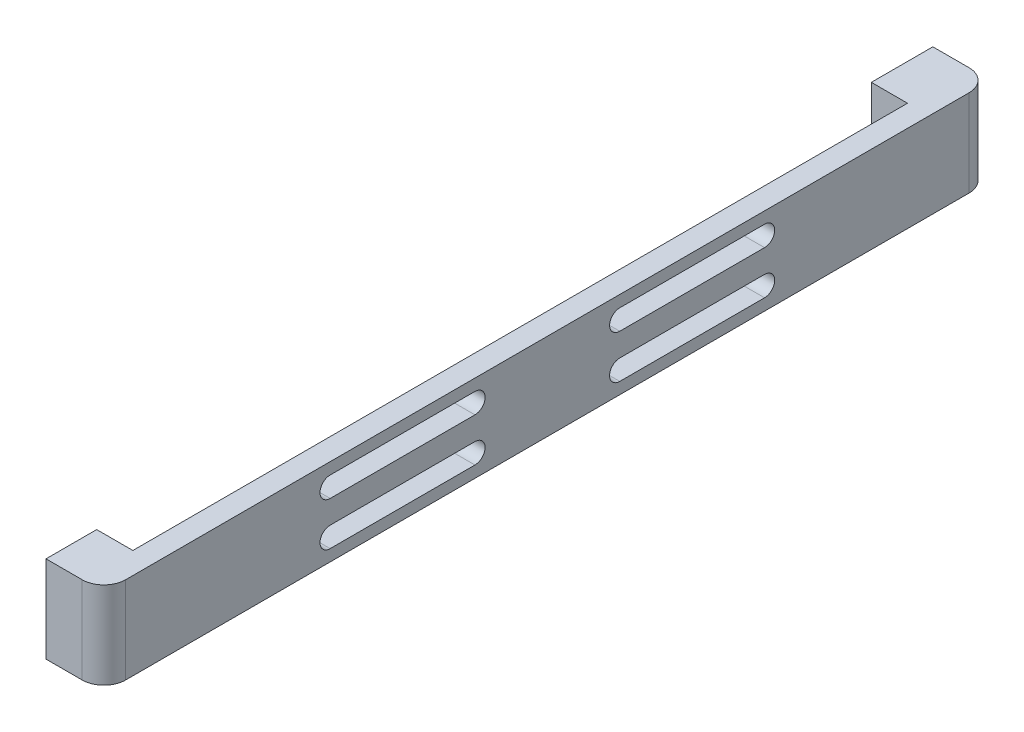
ISO-10303-21;
HEADER;
FILE_DESCRIPTION(('STEP AP214'),'2;1');
FILE_NAME('part.step','',(''),(''),'','','');
FILE_SCHEMA(('AUTOMOTIVE_DESIGN { 1 0 10303 214 1 1 1 1 }'));
ENDSEC;
DATA;
#1=APPLICATION_CONTEXT('core data for automotive mechanical design processes');
#2=APPLICATION_PROTOCOL_DEFINITION('international standard','automotive_design',2000,#1);
#3=PRODUCT_CONTEXT('',#1,'mechanical');
#4=PRODUCT('Part','Part','',(#3));
#5=PRODUCT_RELATED_PRODUCT_CATEGORY('part','',(#4));
#6=PRODUCT_DEFINITION_FORMATION('','',#4);
#7=PRODUCT_DEFINITION_CONTEXT('part definition',#1,'design');
#8=PRODUCT_DEFINITION('design','',#6,#7);
#9=PRODUCT_DEFINITION_SHAPE('','',#8);
#10=(LENGTH_UNIT() NAMED_UNIT(*) SI_UNIT(.MILLI.,.METRE.));
#11=(NAMED_UNIT(*) PLANE_ANGLE_UNIT() SI_UNIT($,.RADIAN.));
#12=(NAMED_UNIT(*) SI_UNIT($,.STERADIAN.) SOLID_ANGLE_UNIT());
#13=UNCERTAINTY_MEASURE_WITH_UNIT(LENGTH_MEASURE(1.E-05),#10,'distance_accuracy_value','');
#14=(GEOMETRIC_REPRESENTATION_CONTEXT(3) GLOBAL_UNCERTAINTY_ASSIGNED_CONTEXT((#13)) GLOBAL_UNIT_ASSIGNED_CONTEXT((#10,
#11,#12)) REPRESENTATION_CONTEXT('',''));
#15=CARTESIAN_POINT('',(0.,0.,0.));
#16=DIRECTION('',(0.,0.,1.));
#17=DIRECTION('',(1.,0.,0.));
#18=AXIS2_PLACEMENT_3D('',#15,#16,#17);
#19=CARTESIAN_POINT('',(5.,0.,0.));
#20=DIRECTION('',(1.,0.,0.));
#21=DIRECTION('',(0.,0.,-1.));
#22=AXIS2_PLACEMENT_3D('',#19,#20,#21);
#23=PLANE('',#22);
#24=CARTESIAN_POINT('',(5.,-3.,29.25));
#25=DIRECTION('',(1.,0.,0.));
#26=DIRECTION('',(0.,0.,-1.));
#27=AXIS2_PLACEMENT_3D('',#24,#25,#26);
#28=CIRCLE('',#27,1.4);
#29=CARTESIAN_POINT('',(5.,-1.6,29.25));
#30=VERTEX_POINT('',#29);
#31=CARTESIAN_POINT('',(5.,-4.4,29.25));
#32=VERTEX_POINT('',#31);
#33=EDGE_CURVE('E261',#30,#32,#28,.T.);
#34=ORIENTED_EDGE('',*,*,#33,.T.);
#35=DIRECTION('',(0.,0.,-1.));
#36=VECTOR('',#35,1.);
#37=CARTESIAN_POINT('',(5.,-4.4,0.));
#38=LINE('',#37,#36);
#39=CARTESIAN_POINT('',(5.,-4.4,9.25000000000001));
#40=VERTEX_POINT('',#39);
#41=EDGE_CURVE('E251',#32,#40,#38,.T.);
#42=ORIENTED_EDGE('',*,*,#41,.T.);
#43=CARTESIAN_POINT('',(5.,-3.,9.25000000000001));
#44=DIRECTION('',(1.,0.,0.));
#45=DIRECTION('',(0.,0.,-1.));
#46=AXIS2_PLACEMENT_3D('',#43,#44,#45);
#47=CIRCLE('',#46,1.4);
#48=CARTESIAN_POINT('',(5.,-1.6,9.25000000000001));
#49=VERTEX_POINT('',#48);
#50=EDGE_CURVE('E254',#40,#49,#47,.T.);
#51=ORIENTED_EDGE('',*,*,#50,.T.);
#52=DIRECTION('',(0.,0.,-1.));
#53=VECTOR('',#52,1.);
#54=CARTESIAN_POINT('',(5.,-1.59999999999999,0.));
#55=LINE('',#54,#53);
#56=EDGE_CURVE('E258',#30,#49,#55,.T.);
#57=ORIENTED_EDGE('',*,*,#56,.F.);
#58=EDGE_LOOP('',(#34,#42,#51,#57));
#59=FACE_BOUND('',#58,.T.);
#60=CARTESIAN_POINT('',(5.,3.00000000000001,-30.75));
#61=DIRECTION('',(1.,0.,0.));
#62=DIRECTION('',(0.,0.,-1.));
#63=AXIS2_PLACEMENT_3D('',#60,#61,#62);
#64=CIRCLE('',#63,1.4);
#65=CARTESIAN_POINT('',(5.,1.6,-30.75));
#66=VERTEX_POINT('',#65);
#67=CARTESIAN_POINT('',(5.,4.40000000000001,-30.75));
#68=VERTEX_POINT('',#67);
#69=EDGE_CURVE('E295',#66,#68,#64,.T.);
#70=ORIENTED_EDGE('',*,*,#69,.T.);
#71=DIRECTION('',(0.,0.,1.));
#72=VECTOR('',#71,1.);
#73=CARTESIAN_POINT('',(5.,4.4,0.));
#74=LINE('',#73,#72);
#75=CARTESIAN_POINT('',(5.,4.4,-10.75));
#76=VERTEX_POINT('',#75);
#77=EDGE_CURVE('E285',#68,#76,#74,.T.);
#78=ORIENTED_EDGE('',*,*,#77,.T.);
#79=CARTESIAN_POINT('',(5.,3.,-10.75));
#80=DIRECTION('',(1.,0.,0.));
#81=DIRECTION('',(0.,0.,-1.));
#82=AXIS2_PLACEMENT_3D('',#79,#80,#81);
#83=CIRCLE('',#82,1.4);
#84=CARTESIAN_POINT('',(5.,1.6,-10.75));
#85=VERTEX_POINT('',#84);
#86=EDGE_CURVE('E288',#76,#85,#83,.T.);
#87=ORIENTED_EDGE('',*,*,#86,.T.);
#88=DIRECTION('',(0.,0.,1.));
#89=VECTOR('',#88,1.);
#90=CARTESIAN_POINT('',(5.,1.59999999999999,0.));
#91=LINE('',#90,#89);
#92=EDGE_CURVE('E292',#66,#85,#91,.T.);
#93=ORIENTED_EDGE('',*,*,#92,.F.);
#94=EDGE_LOOP('',(#70,#78,#87,#93));
#95=FACE_BOUND('',#94,.T.);
#96=CARTESIAN_POINT('',(5.,-2.99999999999999,-30.75));
#97=DIRECTION('',(1.,0.,0.));
#98=DIRECTION('',(0.,0.,-1.));
#99=AXIS2_PLACEMENT_3D('',#96,#97,#98);
#100=CIRCLE('',#99,1.4);
#101=CARTESIAN_POINT('',(5.,-4.4,-30.75));
#102=VERTEX_POINT('',#101);
#103=CARTESIAN_POINT('',(5.,-1.6,-30.75));
#104=VERTEX_POINT('',#103);
#105=EDGE_CURVE('E220',#102,#104,#100,.T.);
#106=ORIENTED_EDGE('',*,*,#105,.T.);
#107=DIRECTION('',(0.,0.,1.));
#108=VECTOR('',#107,1.);
#109=CARTESIAN_POINT('',(5.,-1.6,0.));
#110=LINE('',#109,#108);
#111=CARTESIAN_POINT('',(5.,-1.6,-10.75));
#112=VERTEX_POINT('',#111);
#113=EDGE_CURVE('E212',#104,#112,#110,.T.);
#114=ORIENTED_EDGE('',*,*,#113,.T.);
#115=CARTESIAN_POINT('',(5.,-3.,-10.75));
#116=DIRECTION('',(1.,0.,0.));
#117=DIRECTION('',(0.,0.,-1.));
#118=AXIS2_PLACEMENT_3D('',#115,#116,#117);
#119=CIRCLE('',#118,1.4);
#120=CARTESIAN_POINT('',(5.,-4.4,-10.75));
#121=VERTEX_POINT('',#120);
#122=EDGE_CURVE('E223',#112,#121,#119,.T.);
#123=ORIENTED_EDGE('',*,*,#122,.T.);
#124=DIRECTION('',(0.,0.,1.));
#125=VECTOR('',#124,1.);
#126=CARTESIAN_POINT('',(5.,-4.40000000000001,0.));
#127=LINE('',#126,#125);
#128=EDGE_CURVE('E228',#102,#121,#127,.T.);
#129=ORIENTED_EDGE('',*,*,#128,.F.);
#130=EDGE_LOOP('',(#106,#114,#123,#129));
#131=FACE_BOUND('',#130,.T.);
#132=DIRECTION('',(0.,0.,1.));
#133=VECTOR('',#132,1.);
#134=CARTESIAN_POINT('',(5.,5.99999999999999,60.5));
#135=LINE('',#134,#133);
#136=CARTESIAN_POINT('',(5.,6.00000000000001,-53.5));
#137=VERTEX_POINT('',#136);
#138=CARTESIAN_POINT('',(5.,5.99999999999999,53.5));
#139=VERTEX_POINT('',#138);
#140=EDGE_CURVE('E370',#137,#139,#135,.T.);
#141=ORIENTED_EDGE('',*,*,#140,.F.);
#142=DIRECTION('',(0.,1.,0.));
#143=VECTOR('',#142,1.);
#144=CARTESIAN_POINT('',(5.,0.,-53.5));
#145=LINE('',#144,#143);
#146=CARTESIAN_POINT('',(5.,-5.99999999999999,-53.5));
#147=VERTEX_POINT('',#146);
#148=EDGE_CURVE('E347',#147,#137,#145,.T.);
#149=ORIENTED_EDGE('',*,*,#148,.F.);
#150=DIRECTION('',(0.,0.,-1.));
#151=VECTOR('',#150,1.);
#152=CARTESIAN_POINT('',(5.,-5.99999999999999,60.5));
#153=LINE('',#152,#151);
#154=CARTESIAN_POINT('',(5.,-6.00000000000001,53.5));
#155=VERTEX_POINT('',#154);
#156=EDGE_CURVE('E365',#155,#147,#153,.T.);
#157=ORIENTED_EDGE('',*,*,#156,.F.);
#158=DIRECTION('',(0.,1.,0.));
#159=VECTOR('',#158,1.);
#160=CARTESIAN_POINT('',(5.,0.,53.5));
#161=LINE('',#160,#159);
#162=EDGE_CURVE('E381',#155,#139,#161,.T.);
#163=ORIENTED_EDGE('',*,*,#162,.T.);
#164=EDGE_LOOP('',(#141,#149,#157,#163));
#165=FACE_BOUND('',#164,.T.);
#166=DIRECTION('',(0.,0.,-1.));
#167=VECTOR('',#166,1.);
#168=CARTESIAN_POINT('',(5.,4.40000000000001,0.));
#169=LINE('',#168,#167);
#170=CARTESIAN_POINT('',(5.,4.4,29.25));
#171=VERTEX_POINT('',#170);
#172=CARTESIAN_POINT('',(5.,4.4,9.25000000000001));
#173=VERTEX_POINT('',#172);
#174=EDGE_CURVE('E315',#171,#173,#169,.T.);
#175=ORIENTED_EDGE('',*,*,#174,.F.);
#176=CARTESIAN_POINT('',(5.,3.,29.25));
#177=DIRECTION('',(1.,0.,0.));
#178=DIRECTION('',(0.,0.,-1.));
#179=AXIS2_PLACEMENT_3D('',#176,#177,#178);
#180=CIRCLE('',#179,1.4);
#181=CARTESIAN_POINT('',(5.,1.6,29.25));
#182=VERTEX_POINT('',#181);
#183=EDGE_CURVE('E317',#171,#182,#180,.T.);
#184=ORIENTED_EDGE('',*,*,#183,.T.);
#185=DIRECTION('',(0.,0.,-1.));
#186=VECTOR('',#185,1.);
#187=CARTESIAN_POINT('',(5.,1.60000000000001,0.));
#188=LINE('',#187,#186);
#189=CARTESIAN_POINT('',(5.,1.6,9.25000000000001));
#190=VERTEX_POINT('',#189);
#191=EDGE_CURVE('E321',#182,#190,#188,.T.);
#192=ORIENTED_EDGE('',*,*,#191,.T.);
#193=CARTESIAN_POINT('',(5.,3.,9.25000000000001));
#194=DIRECTION('',(1.,0.,0.));
#195=DIRECTION('',(0.,0.,-1.));
#196=AXIS2_PLACEMENT_3D('',#193,#194,#195);
#197=CIRCLE('',#196,1.4);
#198=EDGE_CURVE('E324',#190,#173,#197,.T.);
#199=ORIENTED_EDGE('',*,*,#198,.T.);
#200=EDGE_LOOP('',(#175,#184,#192,#199));
#201=FACE_BOUND('',#200,.T.);
#202=ADVANCED_FACE('F35',(#59,#95,#131,#165,#201),#23,.F.);
#203=CARTESIAN_POINT('',(8.,0.,0.));
#204=DIRECTION('',(1.,0.,0.));
#205=DIRECTION('',(0.,0.,-1.));
#206=AXIS2_PLACEMENT_3D('',#203,#204,#205);
#207=PLANE('',#206);
#208=DIRECTION('',(0.,0.,-1.));
#209=VECTOR('',#208,1.);
#210=CARTESIAN_POINT('',(8.,-4.4,0.));
#211=LINE('',#210,#209);
#212=CARTESIAN_POINT('',(8.,-4.4,29.25));
#213=VERTEX_POINT('',#212);
#214=CARTESIAN_POINT('',(8.,-4.4,9.25000000000001));
#215=VERTEX_POINT('',#214);
#216=EDGE_CURVE('E265',#213,#215,#211,.T.);
#217=ORIENTED_EDGE('',*,*,#216,.F.);
#218=CARTESIAN_POINT('',(8.,-3.,29.25));
#219=DIRECTION('',(1.,0.,0.));
#220=DIRECTION('',(0.,0.,-1.));
#221=AXIS2_PLACEMENT_3D('',#218,#219,#220);
#222=CIRCLE('',#221,1.4);
#223=CARTESIAN_POINT('',(8.,-1.6,29.25));
#224=VERTEX_POINT('',#223);
#225=EDGE_CURVE('E255',#224,#213,#222,.T.);
#226=ORIENTED_EDGE('',*,*,#225,.F.);
#227=DIRECTION('',(0.,0.,-1.));
#228=VECTOR('',#227,1.);
#229=CARTESIAN_POINT('',(8.,-1.59999999999999,0.));
#230=LINE('',#229,#228);
#231=CARTESIAN_POINT('',(8.,-1.6,9.25000000000001));
#232=VERTEX_POINT('',#231);
#233=EDGE_CURVE('E271',#224,#232,#230,.T.);
#234=ORIENTED_EDGE('',*,*,#233,.T.);
#235=CARTESIAN_POINT('',(8.,-3.,9.25000000000001));
#236=DIRECTION('',(1.,0.,0.));
#237=DIRECTION('',(0.,0.,-1.));
#238=AXIS2_PLACEMENT_3D('',#235,#236,#237);
#239=CIRCLE('',#238,1.4);
#240=EDGE_CURVE('E267',#215,#232,#239,.T.);
#241=ORIENTED_EDGE('',*,*,#240,.F.);
#242=EDGE_LOOP('',(#217,#226,#234,#241));
#243=FACE_BOUND('',#242,.T.);
#244=DIRECTION('',(0.,0.,1.));
#245=VECTOR('',#244,1.);
#246=CARTESIAN_POINT('',(8.,4.4,0.));
#247=LINE('',#246,#245);
#248=CARTESIAN_POINT('',(8.,4.40000000000001,-30.75));
#249=VERTEX_POINT('',#248);
#250=CARTESIAN_POINT('',(8.,4.4,-10.75));
#251=VERTEX_POINT('',#250);
#252=EDGE_CURVE('E247',#249,#251,#247,.T.);
#253=ORIENTED_EDGE('',*,*,#252,.F.);
#254=CARTESIAN_POINT('',(8.,3.00000000000001,-30.75));
#255=DIRECTION('',(1.,0.,0.));
#256=DIRECTION('',(0.,0.,-1.));
#257=AXIS2_PLACEMENT_3D('',#254,#255,#256);
#258=CIRCLE('',#257,1.4);
#259=CARTESIAN_POINT('',(8.,1.6,-30.75));
#260=VERTEX_POINT('',#259);
#261=EDGE_CURVE('E289',#260,#249,#258,.T.);
#262=ORIENTED_EDGE('',*,*,#261,.F.);
#263=DIRECTION('',(0.,0.,1.));
#264=VECTOR('',#263,1.);
#265=CARTESIAN_POINT('',(8.,1.59999999999999,0.));
#266=LINE('',#265,#264);
#267=CARTESIAN_POINT('',(8.,1.6,-10.75));
#268=VERTEX_POINT('',#267);
#269=EDGE_CURVE('E303',#260,#268,#266,.T.);
#270=ORIENTED_EDGE('',*,*,#269,.T.);
#271=CARTESIAN_POINT('',(8.,3.,-10.75));
#272=DIRECTION('',(1.,0.,0.));
#273=DIRECTION('',(0.,0.,-1.));
#274=AXIS2_PLACEMENT_3D('',#271,#272,#273);
#275=CIRCLE('',#274,1.4);
#276=EDGE_CURVE('E300',#251,#268,#275,.T.);
#277=ORIENTED_EDGE('',*,*,#276,.F.);
#278=EDGE_LOOP('',(#253,#262,#270,#277));
#279=FACE_BOUND('',#278,.T.);
#280=DIRECTION('',(0.,0.,1.));
#281=VECTOR('',#280,1.);
#282=CARTESIAN_POINT('',(8.,-1.6,0.));
#283=LINE('',#282,#281);
#284=CARTESIAN_POINT('',(8.,-1.6,-30.75));
#285=VERTEX_POINT('',#284);
#286=CARTESIAN_POINT('',(8.,-1.6,-10.75));
#287=VERTEX_POINT('',#286);
#288=EDGE_CURVE('E215',#285,#287,#283,.T.);
#289=ORIENTED_EDGE('',*,*,#288,.F.);
#290=CARTESIAN_POINT('',(8.,-2.99999999999999,-30.75));
#291=DIRECTION('',(1.,0.,0.));
#292=DIRECTION('',(0.,0.,-1.));
#293=AXIS2_PLACEMENT_3D('',#290,#291,#292);
#294=CIRCLE('',#293,1.4);
#295=CARTESIAN_POINT('',(8.,-4.4,-30.75));
#296=VERTEX_POINT('',#295);
#297=EDGE_CURVE('E232',#296,#285,#294,.T.);
#298=ORIENTED_EDGE('',*,*,#297,.F.);
#299=DIRECTION('',(0.,0.,1.));
#300=VECTOR('',#299,1.);
#301=CARTESIAN_POINT('',(8.,-4.40000000000001,0.));
#302=LINE('',#301,#300);
#303=CARTESIAN_POINT('',(8.,-4.4,-10.75));
#304=VERTEX_POINT('',#303);
#305=EDGE_CURVE('E235',#296,#304,#302,.T.);
#306=ORIENTED_EDGE('',*,*,#305,.T.);
#307=CARTESIAN_POINT('',(8.,-3.,-10.75));
#308=DIRECTION('',(1.,0.,0.));
#309=DIRECTION('',(0.,0.,-1.));
#310=AXIS2_PLACEMENT_3D('',#307,#308,#309);
#311=CIRCLE('',#310,1.4);
#312=EDGE_CURVE('E241',#287,#304,#311,.T.);
#313=ORIENTED_EDGE('',*,*,#312,.F.);
#314=EDGE_LOOP('',(#289,#298,#306,#313));
#315=FACE_BOUND('',#314,.T.);
#316=DIRECTION('',(0.,0.,-1.));
#317=VECTOR('',#316,1.);
#318=CARTESIAN_POINT('',(8.,-5.99999999999999,60.5));
#319=LINE('',#318,#317);
#320=CARTESIAN_POINT('',(8.,-5.99999999999999,57.5));
#321=VERTEX_POINT('',#320);
#322=CARTESIAN_POINT('',(8.,-5.99999999999999,-59.));
#323=VERTEX_POINT('',#322);
#324=EDGE_CURVE('E366',#321,#323,#319,.T.);
#325=ORIENTED_EDGE('',*,*,#324,.T.);
#326=DIRECTION('',(0.,1.,0.));
#327=VECTOR('',#326,1.);
#328=CARTESIAN_POINT('',(8.,5.99999999999999,-59.));
#329=LINE('',#328,#327);
#330=CARTESIAN_POINT('',(8.,5.99999999999999,-59.));
#331=VERTEX_POINT('',#330);
#332=EDGE_CURVE('E406',#323,#331,#329,.T.);
#333=ORIENTED_EDGE('',*,*,#332,.T.);
#334=DIRECTION('',(0.,0.,1.));
#335=VECTOR('',#334,1.);
#336=CARTESIAN_POINT('',(8.,5.99999999999999,60.5));
#337=LINE('',#336,#335);
#338=CARTESIAN_POINT('',(8.,5.99999999999999,57.5));
#339=VERTEX_POINT('',#338);
#340=EDGE_CURVE('E369',#331,#339,#337,.T.);
#341=ORIENTED_EDGE('',*,*,#340,.T.);
#342=DIRECTION('',(0.,-1.,0.));
#343=VECTOR('',#342,1.);
#344=CARTESIAN_POINT('',(8.,-5.99999999999999,57.5));
#345=LINE('',#344,#343);
#346=EDGE_CURVE('E403',#339,#321,#345,.T.);
#347=ORIENTED_EDGE('',*,*,#346,.T.);
#348=EDGE_LOOP('',(#325,#333,#341,#347));
#349=FACE_BOUND('',#348,.T.);
#350=CARTESIAN_POINT('',(8.,3.,29.25));
#351=DIRECTION('',(1.,0.,0.));
#352=DIRECTION('',(0.,0.,-1.));
#353=AXIS2_PLACEMENT_3D('',#350,#351,#352);
#354=CIRCLE('',#353,1.4);
#355=CARTESIAN_POINT('',(8.,4.4,29.25));
#356=VERTEX_POINT('',#355);
#357=CARTESIAN_POINT('',(8.,1.6,29.25));
#358=VERTEX_POINT('',#357);
#359=EDGE_CURVE('E330',#356,#358,#354,.T.);
#360=ORIENTED_EDGE('',*,*,#359,.F.);
#361=DIRECTION('',(0.,0.,-1.));
#362=VECTOR('',#361,1.);
#363=CARTESIAN_POINT('',(8.,4.40000000000001,0.));
#364=LINE('',#363,#362);
#365=CARTESIAN_POINT('',(8.,4.4,9.25000000000001));
#366=VERTEX_POINT('',#365);
#367=EDGE_CURVE('E278',#356,#366,#364,.T.);
#368=ORIENTED_EDGE('',*,*,#367,.T.);
#369=CARTESIAN_POINT('',(8.,3.,9.25000000000001));
#370=DIRECTION('',(1.,0.,0.));
#371=DIRECTION('',(0.,0.,-1.));
#372=AXIS2_PLACEMENT_3D('',#369,#370,#371);
#373=CIRCLE('',#372,1.4);
#374=CARTESIAN_POINT('',(8.,1.6,9.25000000000001));
#375=VERTEX_POINT('',#374);
#376=EDGE_CURVE('E318',#375,#366,#373,.T.);
#377=ORIENTED_EDGE('',*,*,#376,.F.);
#378=DIRECTION('',(0.,0.,-1.));
#379=VECTOR('',#378,1.);
#380=CARTESIAN_POINT('',(8.,1.60000000000001,0.));
#381=LINE('',#380,#379);
#382=EDGE_CURVE('E333',#358,#375,#381,.T.);
#383=ORIENTED_EDGE('',*,*,#382,.F.);
#384=EDGE_LOOP('',(#360,#368,#377,#383));
#385=FACE_BOUND('',#384,.T.);
#386=ADVANCED_FACE('F419',(#243,#279,#315,#349,#385),#207,.T.);
#387=CARTESIAN_POINT('',(5.,5.99999999999998,0.));
#388=DIRECTION('',(0.,-1.,0.));
#389=DIRECTION('',(0.,0.,-1.));
#390=AXIS2_PLACEMENT_3D('',#387,#388,#389);
#391=PLANE('',#390);
#392=ORIENTED_EDGE('',*,*,#340,.F.);
#393=CARTESIAN_POINT('',(5.,5.99999999999996,-59.));
#394=DIRECTION('',(0.,-1.,0.));
#395=DIRECTION('',(0.,0.,-1.));
#396=AXIS2_PLACEMENT_3D('',#393,#394,#395);
#397=CIRCLE('',#396,3.);
#398=CARTESIAN_POINT('',(5.,5.99999999999999,-62.));
#399=VERTEX_POINT('',#398);
#400=EDGE_CURVE('E411',#331,#399,#397,.F.);
#401=ORIENTED_EDGE('',*,*,#400,.T.);
#402=DIRECTION('',(-1.,0.,0.));
#403=VECTOR('',#402,1.);
#404=CARTESIAN_POINT('',(8.,5.99999999999999,-62.));
#405=LINE('',#404,#403);
#406=CARTESIAN_POINT('',(0.,6.00000000000001,-62.));
#407=VERTEX_POINT('',#406);
#408=EDGE_CURVE('E373',#399,#407,#405,.T.);
#409=ORIENTED_EDGE('',*,*,#408,.T.);
#410=DIRECTION('',(0.,0.,-1.));
#411=VECTOR('',#410,1.);
#412=CARTESIAN_POINT('',(0.,6.,0.));
#413=LINE('',#412,#411);
#414=CARTESIAN_POINT('',(0.,6.00000000000001,-53.5));
#415=VERTEX_POINT('',#414);
#416=EDGE_CURVE('E354',#415,#407,#413,.T.);
#417=ORIENTED_EDGE('',*,*,#416,.F.);
#418=DIRECTION('',(-1.,0.,0.));
#419=VECTOR('',#418,1.);
#420=CARTESIAN_POINT('',(5.,6.00000000000001,-53.5));
#421=LINE('',#420,#419);
#422=EDGE_CURVE('E363',#137,#415,#421,.T.);
#423=ORIENTED_EDGE('',*,*,#422,.F.);
#424=ORIENTED_EDGE('',*,*,#140,.T.);
#425=DIRECTION('',(-1.,0.,0.));
#426=VECTOR('',#425,1.);
#427=CARTESIAN_POINT('',(5.,5.99999999999999,53.5));
#428=LINE('',#427,#426);
#429=CARTESIAN_POINT('',(0.,5.99999999999999,53.5));
#430=VERTEX_POINT('',#429);
#431=EDGE_CURVE('E384',#139,#430,#428,.T.);
#432=ORIENTED_EDGE('',*,*,#431,.T.);
#433=DIRECTION('',(0.,0.,1.));
#434=VECTOR('',#433,1.);
#435=CARTESIAN_POINT('',(0.,5.99999999999998,0.));
#436=LINE('',#435,#434);
#437=CARTESIAN_POINT('',(0.,5.99999999999999,60.5));
#438=VERTEX_POINT('',#437);
#439=EDGE_CURVE('E380',#430,#438,#436,.T.);
#440=ORIENTED_EDGE('',*,*,#439,.T.);
#441=DIRECTION('',(-1.,0.,0.));
#442=VECTOR('',#441,1.);
#443=CARTESIAN_POINT('',(5.,5.99999999999999,60.5));
#444=LINE('',#443,#442);
#445=CARTESIAN_POINT('',(5.,5.99999999999999,60.5));
#446=VERTEX_POINT('',#445);
#447=EDGE_CURVE('E401',#446,#438,#444,.T.);
#448=ORIENTED_EDGE('',*,*,#447,.F.);
#449=CARTESIAN_POINT('',(5.,5.99999999999999,57.5));
#450=DIRECTION('',(0.,-1.,0.));
#451=DIRECTION('',(0.,0.,-1.));
#452=AXIS2_PLACEMENT_3D('',#449,#450,#451);
#453=CIRCLE('',#452,3.);
#454=EDGE_CURVE('E409',#446,#339,#453,.F.);
#455=ORIENTED_EDGE('',*,*,#454,.T.);
#456=EDGE_LOOP('',(#392,#401,#409,#417,#423,#424,#432,#440,#448,#455));
#457=FACE_BOUND('',#456,.T.);
#458=ADVANCED_FACE('F425',(#457),#391,.F.);
#459=CARTESIAN_POINT('',(5.,0.,60.5));
#460=DIRECTION('',(0.,0.,-1.));
#461=DIRECTION('',(-1.,0.,0.));
#462=AXIS2_PLACEMENT_3D('',#459,#460,#461);
#463=PLANE('',#462);
#464=DIRECTION('',(-1.,0.,0.));
#465=VECTOR('',#464,1.);
#466=CARTESIAN_POINT('',(5.,-6.00000000000001,60.5));
#467=LINE('',#466,#465);
#468=CARTESIAN_POINT('',(5.,-6.00000000000001,60.5));
#469=VERTEX_POINT('',#468);
#470=CARTESIAN_POINT('',(0.,-6.00000000000001,60.5));
#471=VERTEX_POINT('',#470);
#472=EDGE_CURVE('E399',#469,#471,#467,.T.);
#473=ORIENTED_EDGE('',*,*,#472,.F.);
#474=DIRECTION('',(0.,-1.,0.));
#475=VECTOR('',#474,1.);
#476=CARTESIAN_POINT('',(5.,5.99999999999999,60.5));
#477=LINE('',#476,#475);
#478=EDGE_CURVE('E11',#469,#446,#477,.F.);
#479=ORIENTED_EDGE('',*,*,#478,.T.);
#480=ORIENTED_EDGE('',*,*,#447,.T.);
#481=DIRECTION('',(0.,-1.,0.));
#482=VECTOR('',#481,1.);
#483=CARTESIAN_POINT('',(0.,0.,60.5));
#484=LINE('',#483,#482);
#485=EDGE_CURVE('E388',#438,#471,#484,.T.);
#486=ORIENTED_EDGE('',*,*,#485,.T.);
#487=EDGE_LOOP('',(#473,#479,#480,#486));
#488=FACE_BOUND('',#487,.T.);
#489=ADVANCED_FACE('F451',(#488),#463,.F.);
#490=CARTESIAN_POINT('',(5.,-6.,0.));
#491=DIRECTION('',(0.,-1.,0.));
#492=DIRECTION('',(0.,0.,-1.));
#493=AXIS2_PLACEMENT_3D('',#490,#491,#492);
#494=PLANE('',#493);
#495=DIRECTION('',(-1.,0.,0.));
#496=VECTOR('',#495,1.);
#497=CARTESIAN_POINT('',(8.,-5.99999999999999,-62.));
#498=LINE('',#497,#496);
#499=CARTESIAN_POINT('',(5.,-5.99999999999999,-62.));
#500=VERTEX_POINT('',#499);
#501=CARTESIAN_POINT('',(0.,-5.99999999999999,-62.));
#502=VERTEX_POINT('',#501);
#503=EDGE_CURVE('E378',#500,#502,#498,.T.);
#504=ORIENTED_EDGE('',*,*,#503,.F.);
#505=CARTESIAN_POINT('',(5.,-5.99999999999999,-59.));
#506=DIRECTION('',(0.,-1.,0.));
#507=DIRECTION('',(0.,0.,-1.));
#508=AXIS2_PLACEMENT_3D('',#505,#506,#507);
#509=CIRCLE('',#508,3.);
#510=EDGE_CURVE('E43',#500,#323,#509,.T.);
#511=ORIENTED_EDGE('',*,*,#510,.T.);
#512=ORIENTED_EDGE('',*,*,#324,.F.);
#513=CARTESIAN_POINT('',(5.,-6.00000000000001,57.5));
#514=DIRECTION('',(0.,-1.,0.));
#515=DIRECTION('',(0.,0.,-1.));
#516=AXIS2_PLACEMENT_3D('',#513,#514,#515);
#517=CIRCLE('',#516,3.);
#518=EDGE_CURVE('E50',#321,#469,#517,.T.);
#519=ORIENTED_EDGE('',*,*,#518,.T.);
#520=ORIENTED_EDGE('',*,*,#472,.T.);
#521=DIRECTION('',(0.,0.,1.));
#522=VECTOR('',#521,1.);
#523=CARTESIAN_POINT('',(0.,-6.,0.));
#524=LINE('',#523,#522);
#525=CARTESIAN_POINT('',(0.,-6.00000000000001,53.5));
#526=VERTEX_POINT('',#525);
#527=EDGE_CURVE('E391',#526,#471,#524,.T.);
#528=ORIENTED_EDGE('',*,*,#527,.F.);
#529=DIRECTION('',(-1.,0.,0.));
#530=VECTOR('',#529,1.);
#531=CARTESIAN_POINT('',(5.,-6.00000000000001,53.5));
#532=LINE('',#531,#530);
#533=EDGE_CURVE('E397',#155,#526,#532,.T.);
#534=ORIENTED_EDGE('',*,*,#533,.F.);
#535=ORIENTED_EDGE('',*,*,#156,.T.);
#536=DIRECTION('',(-1.,0.,0.));
#537=VECTOR('',#536,1.);
#538=CARTESIAN_POINT('',(5.,-5.99999999999999,-53.5));
#539=LINE('',#538,#537);
#540=CARTESIAN_POINT('',(0.,-5.99999999999999,-53.5));
#541=VERTEX_POINT('',#540);
#542=EDGE_CURVE('E350',#147,#541,#539,.T.);
#543=ORIENTED_EDGE('',*,*,#542,.T.);
#544=DIRECTION('',(0.,0.,-1.));
#545=VECTOR('',#544,1.);
#546=CARTESIAN_POINT('',(0.,-5.99999999999999,0.));
#547=LINE('',#546,#545);
#548=EDGE_CURVE('E351',#541,#502,#547,.T.);
#549=ORIENTED_EDGE('',*,*,#548,.T.);
#550=EDGE_LOOP('',(#504,#511,#512,#519,#520,#528,#534,#535,#543,#549));
#551=FACE_BOUND('',#550,.T.);
#552=ADVANCED_FACE('F415',(#551),#494,.T.);
#553=CARTESIAN_POINT('',(5.,0.,53.5));
#554=DIRECTION('',(0.,0.,1.));
#555=DIRECTION('',(1.,0.,0.));
#556=AXIS2_PLACEMENT_3D('',#553,#554,#555);
#557=PLANE('',#556);
#558=DIRECTION('',(0.,1.,0.));
#559=VECTOR('',#558,1.);
#560=CARTESIAN_POINT('',(0.,0.,53.5));
#561=LINE('',#560,#559);
#562=EDGE_CURVE('E385',#526,#430,#561,.T.);
#563=ORIENTED_EDGE('',*,*,#562,.T.);
#564=ORIENTED_EDGE('',*,*,#431,.F.);
#565=ORIENTED_EDGE('',*,*,#162,.F.);
#566=ORIENTED_EDGE('',*,*,#533,.T.);
#567=EDGE_LOOP('',(#563,#564,#565,#566));
#568=FACE_BOUND('',#567,.T.);
#569=ADVANCED_FACE('F442',(#568),#557,.F.);
#570=CARTESIAN_POINT('',(0.,0.,0.));
#571=DIRECTION('',(1.,0.,0.));
#572=DIRECTION('',(0.,0.,-1.));
#573=AXIS2_PLACEMENT_3D('',#570,#571,#572);
#574=PLANE('',#573);
#575=ORIENTED_EDGE('',*,*,#439,.F.);
#576=ORIENTED_EDGE('',*,*,#562,.F.);
#577=ORIENTED_EDGE('',*,*,#527,.T.);
#578=ORIENTED_EDGE('',*,*,#485,.F.);
#579=EDGE_LOOP('',(#575,#576,#577,#578));
#580=FACE_BOUND('',#579,.T.);
#581=ADVANCED_FACE('F448',(#580),#574,.F.);
#582=CARTESIAN_POINT('',(8.,5.99999999999999,-62.));
#583=DIRECTION('',(0.,0.,1.));
#584=DIRECTION('',(1.,0.,0.));
#585=AXIS2_PLACEMENT_3D('',#582,#583,#584);
#586=PLANE('',#585);
#587=ORIENTED_EDGE('',*,*,#408,.F.);
#588=DIRECTION('',(0.,1.,0.));
#589=VECTOR('',#588,1.);
#590=CARTESIAN_POINT('',(5.,-5.99999999999999,-62.));
#591=LINE('',#590,#589);
#592=EDGE_CURVE('E58',#399,#500,#591,.F.);
#593=ORIENTED_EDGE('',*,*,#592,.T.);
#594=ORIENTED_EDGE('',*,*,#503,.T.);
#595=DIRECTION('',(0.,-1.,0.));
#596=VECTOR('',#595,1.);
#597=CARTESIAN_POINT('',(0.,0.,-62.));
#598=LINE('',#597,#596);
#599=EDGE_CURVE('E340',#407,#502,#598,.T.);
#600=ORIENTED_EDGE('',*,*,#599,.F.);
#601=EDGE_LOOP('',(#587,#593,#594,#600));
#602=FACE_BOUND('',#601,.T.);
#603=ADVANCED_FACE('F428',(#602),#586,.F.);
#604=CARTESIAN_POINT('',(5.,0.,-53.5));
#605=DIRECTION('',(0.,0.,1.));
#606=DIRECTION('',(1.,0.,0.));
#607=AXIS2_PLACEMENT_3D('',#604,#605,#606);
#608=PLANE('',#607);
#609=DIRECTION('',(0.,1.,0.));
#610=VECTOR('',#609,1.);
#611=CARTESIAN_POINT('',(0.,0.,-53.5));
#612=LINE('',#611,#610);
#613=EDGE_CURVE('E357',#541,#415,#612,.T.);
#614=ORIENTED_EDGE('',*,*,#613,.F.);
#615=ORIENTED_EDGE('',*,*,#542,.F.);
#616=ORIENTED_EDGE('',*,*,#148,.T.);
#617=ORIENTED_EDGE('',*,*,#422,.T.);
#618=EDGE_LOOP('',(#614,#615,#616,#617));
#619=FACE_BOUND('',#618,.T.);
#620=ADVANCED_FACE('F437',(#619),#608,.T.);
#621=CARTESIAN_POINT('',(0.,0.,0.));
#622=DIRECTION('',(1.,0.,0.));
#623=DIRECTION('',(0.,0.,-1.));
#624=AXIS2_PLACEMENT_3D('',#621,#622,#623);
#625=PLANE('',#624);
#626=ORIENTED_EDGE('',*,*,#599,.T.);
#627=ORIENTED_EDGE('',*,*,#548,.F.);
#628=ORIENTED_EDGE('',*,*,#613,.T.);
#629=ORIENTED_EDGE('',*,*,#416,.T.);
#630=EDGE_LOOP('',(#626,#627,#628,#629));
#631=FACE_BOUND('',#630,.T.);
#632=ADVANCED_FACE('F431',(#631),#625,.F.);
#633=CARTESIAN_POINT('',(5.,4.40000000000001,0.));
#634=DIRECTION('',(0.,-1.,0.));
#635=DIRECTION('',(0.,0.,-1.));
#636=AXIS2_PLACEMENT_3D('',#633,#634,#635);
#637=PLANE('',#636);
#638=ORIENTED_EDGE('',*,*,#367,.F.);
#639=DIRECTION('',(1.,0.,0.));
#640=VECTOR('',#639,1.);
#641=CARTESIAN_POINT('',(5.,4.4,29.25));
#642=LINE('',#641,#640);
#643=EDGE_CURVE('E327',#171,#356,#642,.T.);
#644=ORIENTED_EDGE('',*,*,#643,.F.);
#645=ORIENTED_EDGE('',*,*,#174,.T.);
#646=DIRECTION('',(1.,0.,0.));
#647=VECTOR('',#646,1.);
#648=CARTESIAN_POINT('',(5.,4.4,9.25000000000001));
#649=LINE('',#648,#647);
#650=EDGE_CURVE('E338',#173,#366,#649,.T.);
#651=ORIENTED_EDGE('',*,*,#650,.T.);
#652=EDGE_LOOP('',(#638,#644,#645,#651));
#653=FACE_BOUND('',#652,.T.);
#654=ADVANCED_FACE('F518',(#653),#637,.T.);
#655=CARTESIAN_POINT('',(5.,3.,9.25000000000001));
#656=DIRECTION('',(1.,0.,0.));
#657=DIRECTION('',(0.,0.,-1.));
#658=AXIS2_PLACEMENT_3D('',#655,#656,#657);
#659=CYLINDRICAL_SURFACE('',#658,1.4);
#660=ORIENTED_EDGE('',*,*,#376,.T.);
#661=ORIENTED_EDGE('',*,*,#650,.F.);
#662=ORIENTED_EDGE('',*,*,#198,.F.);
#663=DIRECTION('',(1.,0.,0.));
#664=VECTOR('',#663,1.);
#665=CARTESIAN_POINT('',(5.,1.6,9.25000000000001));
#666=LINE('',#665,#664);
#667=EDGE_CURVE('E341',#190,#375,#666,.T.);
#668=ORIENTED_EDGE('',*,*,#667,.T.);
#669=EDGE_LOOP('',(#660,#661,#662,#668));
#670=FACE_BOUND('',#669,.T.);
#671=ADVANCED_FACE('F525',(#670),#659,.F.);
#672=CARTESIAN_POINT('',(5.,1.60000000000001,0.));
#673=DIRECTION('',(0.,-1.,0.));
#674=DIRECTION('',(0.,0.,-1.));
#675=AXIS2_PLACEMENT_3D('',#672,#673,#674);
#676=PLANE('',#675);
#677=ORIENTED_EDGE('',*,*,#382,.T.);
#678=ORIENTED_EDGE('',*,*,#667,.F.);
#679=ORIENTED_EDGE('',*,*,#191,.F.);
#680=DIRECTION('',(1.,0.,0.));
#681=VECTOR('',#680,1.);
#682=CARTESIAN_POINT('',(5.,1.6,29.25));
#683=LINE('',#682,#681);
#684=EDGE_CURVE('E343',#182,#358,#683,.T.);
#685=ORIENTED_EDGE('',*,*,#684,.T.);
#686=EDGE_LOOP('',(#677,#678,#679,#685));
#687=FACE_BOUND('',#686,.T.);
#688=ADVANCED_FACE('F533',(#687),#676,.F.);
#689=CARTESIAN_POINT('',(5.,3.,29.25));
#690=DIRECTION('',(1.,0.,0.));
#691=DIRECTION('',(0.,0.,-1.));
#692=AXIS2_PLACEMENT_3D('',#689,#690,#691);
#693=CYLINDRICAL_SURFACE('',#692,1.4);
#694=ORIENTED_EDGE('',*,*,#359,.T.);
#695=ORIENTED_EDGE('',*,*,#684,.F.);
#696=ORIENTED_EDGE('',*,*,#183,.F.);
#697=ORIENTED_EDGE('',*,*,#643,.T.);
#698=EDGE_LOOP('',(#694,#695,#696,#697));
#699=FACE_BOUND('',#698,.T.);
#700=ADVANCED_FACE('F541',(#699),#693,.F.);
#701=CARTESIAN_POINT('',(5.,-1.6,0.));
#702=DIRECTION('',(0.,1.,0.));
#703=DIRECTION('',(0.,0.,1.));
#704=AXIS2_PLACEMENT_3D('',#701,#702,#703);
#705=PLANE('',#704);
#706=ORIENTED_EDGE('',*,*,#288,.T.);
#707=DIRECTION('',(1.,0.,0.));
#708=VECTOR('',#707,1.);
#709=CARTESIAN_POINT('',(5.,-1.6,-10.75));
#710=LINE('',#709,#708);
#711=EDGE_CURVE('E208',#112,#287,#710,.T.);
#712=ORIENTED_EDGE('',*,*,#711,.F.);
#713=ORIENTED_EDGE('',*,*,#113,.F.);
#714=DIRECTION('',(1.,0.,0.));
#715=VECTOR('',#714,1.);
#716=CARTESIAN_POINT('',(5.,-1.6,-30.75));
#717=LINE('',#716,#715);
#718=EDGE_CURVE('E245',#104,#285,#717,.T.);
#719=ORIENTED_EDGE('',*,*,#718,.T.);
#720=EDGE_LOOP('',(#706,#712,#713,#719));
#721=FACE_BOUND('',#720,.T.);
#722=ADVANCED_FACE('F210',(#721),#705,.F.);
#723=CARTESIAN_POINT('',(5.,-2.99999999999999,-30.75));
#724=DIRECTION('',(1.,0.,0.));
#725=DIRECTION('',(0.,0.,-1.));
#726=AXIS2_PLACEMENT_3D('',#723,#724,#725);
#727=CYLINDRICAL_SURFACE('',#726,1.4);
#728=ORIENTED_EDGE('',*,*,#297,.T.);
#729=ORIENTED_EDGE('',*,*,#718,.F.);
#730=ORIENTED_EDGE('',*,*,#105,.F.);
#731=DIRECTION('',(1.,0.,0.));
#732=VECTOR('',#731,1.);
#733=CARTESIAN_POINT('',(5.,-4.4,-30.75));
#734=LINE('',#733,#732);
#735=EDGE_CURVE('E248',#102,#296,#734,.T.);
#736=ORIENTED_EDGE('',*,*,#735,.T.);
#737=EDGE_LOOP('',(#728,#729,#730,#736));
#738=FACE_BOUND('',#737,.T.);
#739=ADVANCED_FACE('F556',(#738),#727,.F.);
#740=CARTESIAN_POINT('',(5.,-4.40000000000001,0.));
#741=DIRECTION('',(0.,1.,0.));
#742=DIRECTION('',(0.,0.,1.));
#743=AXIS2_PLACEMENT_3D('',#740,#741,#742);
#744=PLANE('',#743);
#745=ORIENTED_EDGE('',*,*,#305,.F.);
#746=ORIENTED_EDGE('',*,*,#735,.F.);
#747=ORIENTED_EDGE('',*,*,#128,.T.);
#748=DIRECTION('',(1.,0.,0.));
#749=VECTOR('',#748,1.);
#750=CARTESIAN_POINT('',(5.,-4.4,-10.75));
#751=LINE('',#750,#749);
#752=EDGE_CURVE('E219',#121,#304,#751,.T.);
#753=ORIENTED_EDGE('',*,*,#752,.T.);
#754=EDGE_LOOP('',(#745,#746,#747,#753));
#755=FACE_BOUND('',#754,.T.);
#756=ADVANCED_FACE('F563',(#755),#744,.T.);
#757=CARTESIAN_POINT('',(5.,-3.,-10.75));
#758=DIRECTION('',(1.,0.,0.));
#759=DIRECTION('',(0.,0.,-1.));
#760=AXIS2_PLACEMENT_3D('',#757,#758,#759);
#761=CYLINDRICAL_SURFACE('',#760,1.4);
#762=ORIENTED_EDGE('',*,*,#312,.T.);
#763=ORIENTED_EDGE('',*,*,#752,.F.);
#764=ORIENTED_EDGE('',*,*,#122,.F.);
#765=ORIENTED_EDGE('',*,*,#711,.T.);
#766=EDGE_LOOP('',(#762,#763,#764,#765));
#767=FACE_BOUND('',#766,.T.);
#768=ADVANCED_FACE('F224',(#767),#761,.F.);
#769=CARTESIAN_POINT('',(5.,4.4,0.));
#770=DIRECTION('',(0.,1.,0.));
#771=DIRECTION('',(0.,0.,1.));
#772=AXIS2_PLACEMENT_3D('',#769,#770,#771);
#773=PLANE('',#772);
#774=ORIENTED_EDGE('',*,*,#252,.T.);
#775=DIRECTION('',(1.,0.,0.));
#776=VECTOR('',#775,1.);
#777=CARTESIAN_POINT('',(5.,4.4,-10.75));
#778=LINE('',#777,#776);
#779=EDGE_CURVE('E298',#76,#251,#778,.T.);
#780=ORIENTED_EDGE('',*,*,#779,.F.);
#781=ORIENTED_EDGE('',*,*,#77,.F.);
#782=DIRECTION('',(1.,0.,0.));
#783=VECTOR('',#782,1.);
#784=CARTESIAN_POINT('',(5.,4.40000000000001,-30.75));
#785=LINE('',#784,#783);
#786=EDGE_CURVE('E268',#68,#249,#785,.T.);
#787=ORIENTED_EDGE('',*,*,#786,.T.);
#788=EDGE_LOOP('',(#774,#780,#781,#787));
#789=FACE_BOUND('',#788,.T.);
#790=ADVANCED_FACE('F578',(#789),#773,.F.);
#791=CARTESIAN_POINT('',(5.,3.00000000000001,-30.75));
#792=DIRECTION('',(1.,0.,0.));
#793=DIRECTION('',(0.,0.,-1.));
#794=AXIS2_PLACEMENT_3D('',#791,#792,#793);
#795=CYLINDRICAL_SURFACE('',#794,1.4);
#796=ORIENTED_EDGE('',*,*,#261,.T.);
#797=ORIENTED_EDGE('',*,*,#786,.F.);
#798=ORIENTED_EDGE('',*,*,#69,.F.);
#799=DIRECTION('',(1.,0.,0.));
#800=VECTOR('',#799,1.);
#801=CARTESIAN_POINT('',(5.,1.6,-30.75));
#802=LINE('',#801,#800);
#803=EDGE_CURVE('E309',#66,#260,#802,.T.);
#804=ORIENTED_EDGE('',*,*,#803,.T.);
#805=EDGE_LOOP('',(#796,#797,#798,#804));
#806=FACE_BOUND('',#805,.T.);
#807=ADVANCED_FACE('F585',(#806),#795,.F.);
#808=CARTESIAN_POINT('',(5.,1.59999999999999,0.));
#809=DIRECTION('',(0.,1.,0.));
#810=DIRECTION('',(0.,0.,1.));
#811=AXIS2_PLACEMENT_3D('',#808,#809,#810);
#812=PLANE('',#811);
#813=ORIENTED_EDGE('',*,*,#269,.F.);
#814=ORIENTED_EDGE('',*,*,#803,.F.);
#815=ORIENTED_EDGE('',*,*,#92,.T.);
#816=DIRECTION('',(1.,0.,0.));
#817=VECTOR('',#816,1.);
#818=CARTESIAN_POINT('',(5.,1.6,-10.75));
#819=LINE('',#818,#817);
#820=EDGE_CURVE('E311',#85,#268,#819,.T.);
#821=ORIENTED_EDGE('',*,*,#820,.T.);
#822=EDGE_LOOP('',(#813,#814,#815,#821));
#823=FACE_BOUND('',#822,.T.);
#824=ADVANCED_FACE('F593',(#823),#812,.T.);
#825=CARTESIAN_POINT('',(5.,3.,-10.75));
#826=DIRECTION('',(1.,0.,0.));
#827=DIRECTION('',(0.,0.,-1.));
#828=AXIS2_PLACEMENT_3D('',#825,#826,#827);
#829=CYLINDRICAL_SURFACE('',#828,1.4);
#830=ORIENTED_EDGE('',*,*,#276,.T.);
#831=ORIENTED_EDGE('',*,*,#820,.F.);
#832=ORIENTED_EDGE('',*,*,#86,.F.);
#833=ORIENTED_EDGE('',*,*,#779,.T.);
#834=EDGE_LOOP('',(#830,#831,#832,#833));
#835=FACE_BOUND('',#834,.T.);
#836=ADVANCED_FACE('F601',(#835),#829,.F.);
#837=CARTESIAN_POINT('',(5.,-4.4,0.));
#838=DIRECTION('',(0.,-1.,0.));
#839=DIRECTION('',(0.,0.,-1.));
#840=AXIS2_PLACEMENT_3D('',#837,#838,#839);
#841=PLANE('',#840);
#842=ORIENTED_EDGE('',*,*,#216,.T.);
#843=DIRECTION('',(1.,0.,0.));
#844=VECTOR('',#843,1.);
#845=CARTESIAN_POINT('',(5.,-4.4,9.25000000000001));
#846=LINE('',#845,#844);
#847=EDGE_CURVE('E264',#40,#215,#846,.T.);
#848=ORIENTED_EDGE('',*,*,#847,.F.);
#849=ORIENTED_EDGE('',*,*,#41,.F.);
#850=DIRECTION('',(1.,0.,0.));
#851=VECTOR('',#850,1.);
#852=CARTESIAN_POINT('',(5.,-4.4,29.25));
#853=LINE('',#852,#851);
#854=EDGE_CURVE('E276',#32,#213,#853,.T.);
#855=ORIENTED_EDGE('',*,*,#854,.T.);
#856=EDGE_LOOP('',(#842,#848,#849,#855));
#857=FACE_BOUND('',#856,.T.);
#858=ADVANCED_FACE('F609',(#857),#841,.F.);
#859=CARTESIAN_POINT('',(5.,-3.,29.25));
#860=DIRECTION('',(1.,0.,0.));
#861=DIRECTION('',(0.,0.,-1.));
#862=AXIS2_PLACEMENT_3D('',#859,#860,#861);
#863=CYLINDRICAL_SURFACE('',#862,1.4);
#864=ORIENTED_EDGE('',*,*,#225,.T.);
#865=ORIENTED_EDGE('',*,*,#854,.F.);
#866=ORIENTED_EDGE('',*,*,#33,.F.);
#867=DIRECTION('',(1.,0.,0.));
#868=VECTOR('',#867,1.);
#869=CARTESIAN_POINT('',(5.,-1.6,29.25));
#870=LINE('',#869,#868);
#871=EDGE_CURVE('E279',#30,#224,#870,.T.);
#872=ORIENTED_EDGE('',*,*,#871,.T.);
#873=EDGE_LOOP('',(#864,#865,#866,#872));
#874=FACE_BOUND('',#873,.T.);
#875=ADVANCED_FACE('F617',(#874),#863,.F.);
#876=CARTESIAN_POINT('',(5.,-1.59999999999999,0.));
#877=DIRECTION('',(0.,-1.,0.));
#878=DIRECTION('',(0.,0.,-1.));
#879=AXIS2_PLACEMENT_3D('',#876,#877,#878);
#880=PLANE('',#879);
#881=ORIENTED_EDGE('',*,*,#233,.F.);
#882=ORIENTED_EDGE('',*,*,#871,.F.);
#883=ORIENTED_EDGE('',*,*,#56,.T.);
#884=DIRECTION('',(1.,0.,0.));
#885=VECTOR('',#884,1.);
#886=CARTESIAN_POINT('',(5.,-1.6,9.25000000000001));
#887=LINE('',#886,#885);
#888=EDGE_CURVE('E281',#49,#232,#887,.T.);
#889=ORIENTED_EDGE('',*,*,#888,.T.);
#890=EDGE_LOOP('',(#881,#882,#883,#889));
#891=FACE_BOUND('',#890,.T.);
#892=ADVANCED_FACE('F625',(#891),#880,.T.);
#893=CARTESIAN_POINT('',(5.,-3.,9.25000000000001));
#894=DIRECTION('',(1.,0.,0.));
#895=DIRECTION('',(0.,0.,-1.));
#896=AXIS2_PLACEMENT_3D('',#893,#894,#895);
#897=CYLINDRICAL_SURFACE('',#896,1.4);
#898=ORIENTED_EDGE('',*,*,#240,.T.);
#899=ORIENTED_EDGE('',*,*,#888,.F.);
#900=ORIENTED_EDGE('',*,*,#50,.F.);
#901=ORIENTED_EDGE('',*,*,#847,.T.);
#902=EDGE_LOOP('',(#898,#899,#900,#901));
#903=FACE_BOUND('',#902,.T.);
#904=ADVANCED_FACE('F459',(#903),#897,.F.);
#905=CARTESIAN_POINT('',(5.,0.,-59.));
#906=DIRECTION('',(0.,-1.,0.));
#907=DIRECTION('',(0.,0.,-1.));
#908=AXIS2_PLACEMENT_3D('',#905,#906,#907);
#909=CYLINDRICAL_SURFACE('',#908,3.);
#910=ORIENTED_EDGE('',*,*,#510,.F.);
#911=ORIENTED_EDGE('',*,*,#592,.F.);
#912=ORIENTED_EDGE('',*,*,#400,.F.);
#913=ORIENTED_EDGE('',*,*,#332,.F.);
#914=EDGE_LOOP('',(#910,#911,#912,#913));
#915=FACE_BOUND('',#914,.T.);
#916=ADVANCED_FACE('F423',(#915),#909,.T.);
#917=CARTESIAN_POINT('',(5.,0.,57.5));
#918=DIRECTION('',(0.,1.,0.));
#919=DIRECTION('',(0.,0.,1.));
#920=AXIS2_PLACEMENT_3D('',#917,#918,#919);
#921=CYLINDRICAL_SURFACE('',#920,3.);
#922=ORIENTED_EDGE('',*,*,#454,.F.);
#923=ORIENTED_EDGE('',*,*,#478,.F.);
#924=ORIENTED_EDGE('',*,*,#518,.F.);
#925=ORIENTED_EDGE('',*,*,#346,.F.);
#926=EDGE_LOOP('',(#922,#923,#924,#925));
#927=FACE_BOUND('',#926,.T.);
#928=ADVANCED_FACE('F37',(#927),#921,.T.);
#929=CLOSED_SHELL('',(#202,#386,#458,#489,#552,#569,#581,#603,#620,#632,#654,#671,#688,#700,
#722,#739,#756,#768,#790,#807,#824,#836,#858,#875,#892,#904,#916,#928));
#930=MANIFOLD_SOLID_BREP('B2',#929);
#931=ADVANCED_BREP_SHAPE_REPRESENTATION('',(#18,#930),#14);
#932=SHAPE_DEFINITION_REPRESENTATION(#9,#931);
ENDSEC;
END-ISO-10303-21;
